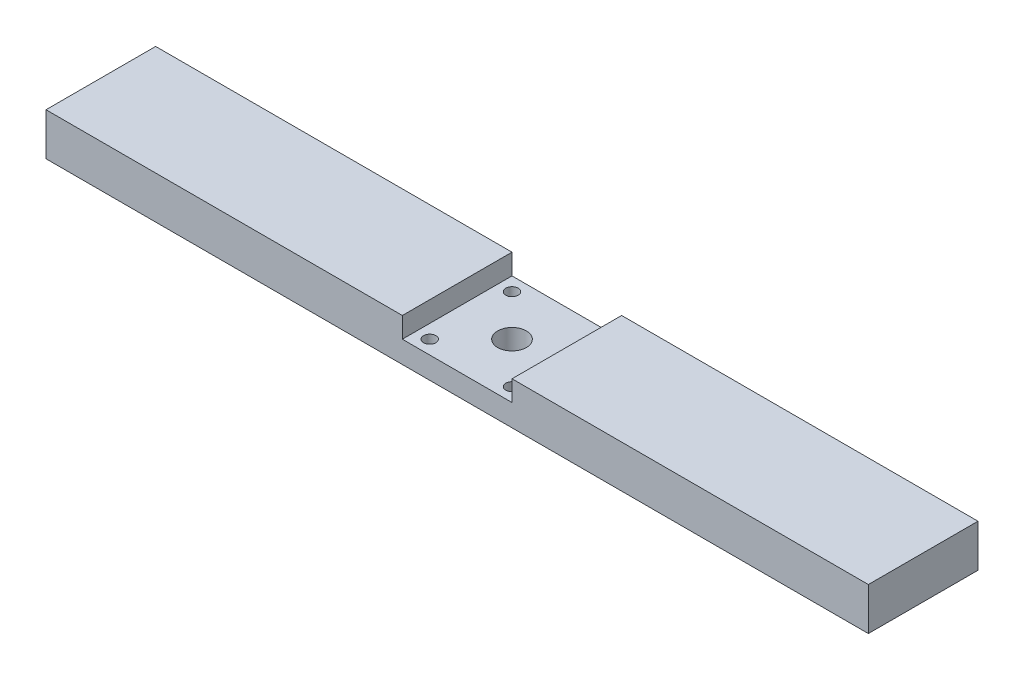
ISO-10303-21;
HEADER;
FILE_DESCRIPTION(('STEP AP214'),'2;1');
FILE_NAME('part.step','',(''),(''),'','','');
FILE_SCHEMA(('AUTOMOTIVE_DESIGN { 1 0 10303 214 1 1 1 1 }'));
ENDSEC;
DATA;
#1=APPLICATION_CONTEXT('core data for automotive mechanical design processes');
#2=APPLICATION_PROTOCOL_DEFINITION('international standard','automotive_design',2000,#1);
#3=PRODUCT_CONTEXT('',#1,'mechanical');
#4=PRODUCT('Part','Part','',(#3));
#5=PRODUCT_RELATED_PRODUCT_CATEGORY('part','',(#4));
#6=PRODUCT_DEFINITION_FORMATION('','',#4);
#7=PRODUCT_DEFINITION_CONTEXT('part definition',#1,'design');
#8=PRODUCT_DEFINITION('design','',#6,#7);
#9=PRODUCT_DEFINITION_SHAPE('','',#8);
#10=(LENGTH_UNIT() NAMED_UNIT(*) SI_UNIT(.MILLI.,.METRE.));
#11=(NAMED_UNIT(*) PLANE_ANGLE_UNIT() SI_UNIT($,.RADIAN.));
#12=(NAMED_UNIT(*) SI_UNIT($,.STERADIAN.) SOLID_ANGLE_UNIT());
#13=UNCERTAINTY_MEASURE_WITH_UNIT(LENGTH_MEASURE(1.E-05),#10,'distance_accuracy_value','');
#14=(GEOMETRIC_REPRESENTATION_CONTEXT(3) GLOBAL_UNCERTAINTY_ASSIGNED_CONTEXT((#13)) GLOBAL_UNIT_ASSIGNED_CONTEXT((#10,
#11,#12)) REPRESENTATION_CONTEXT('',''));
#15=CARTESIAN_POINT('',(0.,0.,0.));
#16=DIRECTION('',(0.,0.,1.));
#17=DIRECTION('',(1.,0.,0.));
#18=AXIS2_PLACEMENT_3D('',#15,#16,#17);
#19=CARTESIAN_POINT('',(-150.,7.75,20.));
#20=DIRECTION('',(0.,-1.,0.));
#21=DIRECTION('',(0.,0.,-1.));
#22=AXIS2_PLACEMENT_3D('',#19,#20,#21);
#23=PLANE('',#22);
#24=DIRECTION('',(-1.,0.,0.));
#25=VECTOR('',#24,1.);
#26=CARTESIAN_POINT('',(-150.,7.75,-20.));
#27=LINE('',#26,#25);
#28=CARTESIAN_POINT('',(-20.,7.75,-20.));
#29=VERTEX_POINT('',#28);
#30=CARTESIAN_POINT('',(-150.,7.75,-20.));
#31=VERTEX_POINT('',#30);
#32=EDGE_CURVE('E129',#29,#31,#27,.T.);
#33=ORIENTED_EDGE('',*,*,#32,.T.);
#34=DIRECTION('',(0.,0.,-1.));
#35=VECTOR('',#34,1.);
#36=CARTESIAN_POINT('',(-150.,7.75,20.));
#37=LINE('',#36,#35);
#38=CARTESIAN_POINT('',(-150.,7.75,20.));
#39=VERTEX_POINT('',#38);
#40=EDGE_CURVE('E11',#39,#31,#37,.T.);
#41=ORIENTED_EDGE('',*,*,#40,.F.);
#42=DIRECTION('',(-1.,0.,0.));
#43=VECTOR('',#42,1.);
#44=CARTESIAN_POINT('',(-150.,7.75,20.));
#45=LINE('',#44,#43);
#46=CARTESIAN_POINT('',(-20.,7.75,20.));
#47=VERTEX_POINT('',#46);
#48=EDGE_CURVE('E144',#47,#39,#45,.T.);
#49=ORIENTED_EDGE('',*,*,#48,.F.);
#50=DIRECTION('',(0.,0.,-1.));
#51=VECTOR('',#50,1.);
#52=CARTESIAN_POINT('',(-20.,7.75,20.));
#53=LINE('',#52,#51);
#54=EDGE_CURVE('E125',#47,#29,#53,.T.);
#55=ORIENTED_EDGE('',*,*,#54,.T.);
#56=EDGE_LOOP('',(#33,#41,#49,#55));
#57=FACE_BOUND('',#56,.T.);
#58=ADVANCED_FACE('F33',(#57),#23,.F.);
#59=CARTESIAN_POINT('',(-150.,7.75,20.));
#60=DIRECTION('',(1.,0.,0.));
#61=DIRECTION('',(0.,0.,-1.));
#62=AXIS2_PLACEMENT_3D('',#59,#60,#61);
#63=PLANE('',#62);
#64=DIRECTION('',(0.,-1.,0.));
#65=VECTOR('',#64,1.);
#66=CARTESIAN_POINT('',(-150.,7.75,-20.));
#67=LINE('',#66,#65);
#68=CARTESIAN_POINT('',(-150.,-7.75,-20.));
#69=VERTEX_POINT('',#68);
#70=EDGE_CURVE('E132',#31,#69,#67,.T.);
#71=ORIENTED_EDGE('',*,*,#70,.T.);
#72=DIRECTION('',(0.,0.,-1.));
#73=VECTOR('',#72,1.);
#74=CARTESIAN_POINT('',(-150.,-7.75,20.));
#75=LINE('',#74,#73);
#76=CARTESIAN_POINT('',(-150.,-7.75,20.));
#77=VERTEX_POINT('',#76);
#78=EDGE_CURVE('E41',#77,#69,#75,.T.);
#79=ORIENTED_EDGE('',*,*,#78,.F.);
#80=DIRECTION('',(0.,-1.,0.));
#81=VECTOR('',#80,1.);
#82=CARTESIAN_POINT('',(-150.,7.75,20.));
#83=LINE('',#82,#81);
#84=EDGE_CURVE('E92',#39,#77,#83,.T.);
#85=ORIENTED_EDGE('',*,*,#84,.F.);
#86=ORIENTED_EDGE('',*,*,#40,.T.);
#87=EDGE_LOOP('',(#71,#79,#85,#86));
#88=FACE_BOUND('',#87,.T.);
#89=ADVANCED_FACE('F227',(#88),#63,.F.);
#90=CARTESIAN_POINT('',(-150.,-7.75,20.));
#91=DIRECTION('',(0.,1.,0.));
#92=DIRECTION('',(-1.,0.,0.));
#93=AXIS2_PLACEMENT_3D('',#90,#91,#92);
#94=PLANE('',#93);
#95=CARTESIAN_POINT('',(-15.015,-7.75000000000001,-15.));
#96=DIRECTION('',(0.,1.,0.));
#97=DIRECTION('',(-1.,0.,0.));
#98=AXIS2_PLACEMENT_3D('',#95,#96,#97);
#99=CIRCLE('',#98,2.25);
#100=CARTESIAN_POINT('',(-17.265,-7.75000000000001,-15.));
#101=VERTEX_POINT('',#100);
#102=EDGE_CURVE('E133',#101,#101,#99,.T.);
#103=ORIENTED_EDGE('',*,*,#102,.T.);
#104=EDGE_LOOP('',(#103));
#105=FACE_BOUND('',#104,.T.);
#106=CARTESIAN_POINT('',(15.015,-7.75000000000002,15.));
#107=DIRECTION('',(0.,1.,0.));
#108=DIRECTION('',(-1.,0.,0.));
#109=AXIS2_PLACEMENT_3D('',#106,#107,#108);
#110=CIRCLE('',#109,2.25);
#111=CARTESIAN_POINT('',(12.765,-7.75000000000002,15.));
#112=VERTEX_POINT('',#111);
#113=EDGE_CURVE('E179',#112,#112,#110,.T.);
#114=ORIENTED_EDGE('',*,*,#113,.T.);
#115=EDGE_LOOP('',(#114));
#116=FACE_BOUND('',#115,.T.);
#117=CARTESIAN_POINT('',(-15.015,-7.75000000000001,15.));
#118=DIRECTION('',(0.,1.,0.));
#119=DIRECTION('',(-1.,0.,0.));
#120=AXIS2_PLACEMENT_3D('',#117,#118,#119);
#121=CIRCLE('',#120,2.25);
#122=CARTESIAN_POINT('',(-17.265,-7.75000000000001,15.));
#123=VERTEX_POINT('',#122);
#124=EDGE_CURVE('E182',#123,#123,#121,.T.);
#125=ORIENTED_EDGE('',*,*,#124,.T.);
#126=EDGE_LOOP('',(#125));
#127=FACE_BOUND('',#126,.T.);
#128=CARTESIAN_POINT('',(0.,-7.75000000000002,0.));
#129=DIRECTION('',(0.,1.,0.));
#130=DIRECTION('',(-1.,0.,0.));
#131=AXIS2_PLACEMENT_3D('',#128,#129,#130);
#132=CIRCLE('',#131,5.25);
#133=CARTESIAN_POINT('',(-5.25,-7.75000000000002,0.));
#134=VERTEX_POINT('',#133);
#135=EDGE_CURVE('E185',#134,#134,#132,.T.);
#136=ORIENTED_EDGE('',*,*,#135,.T.);
#137=EDGE_LOOP('',(#136));
#138=FACE_BOUND('',#137,.T.);
#139=CARTESIAN_POINT('',(15.015,-7.75000000000002,-15.));
#140=DIRECTION('',(0.,1.,0.));
#141=DIRECTION('',(-1.,0.,0.));
#142=AXIS2_PLACEMENT_3D('',#139,#140,#141);
#143=CIRCLE('',#142,2.25);
#144=CARTESIAN_POINT('',(12.765,-7.75000000000002,-15.));
#145=VERTEX_POINT('',#144);
#146=EDGE_CURVE('E188',#145,#145,#143,.T.);
#147=ORIENTED_EDGE('',*,*,#146,.T.);
#148=EDGE_LOOP('',(#147));
#149=FACE_BOUND('',#148,.T.);
#150=DIRECTION('',(1.,0.,0.));
#151=VECTOR('',#150,1.);
#152=CARTESIAN_POINT('',(-150.,-7.75,-20.));
#153=LINE('',#152,#151);
#154=CARTESIAN_POINT('',(150.,-7.75000000000004,-20.));
#155=VERTEX_POINT('',#154);
#156=EDGE_CURVE('E135',#69,#155,#153,.T.);
#157=ORIENTED_EDGE('',*,*,#156,.T.);
#158=DIRECTION('',(0.,0.,-1.));
#159=VECTOR('',#158,1.);
#160=CARTESIAN_POINT('',(150.,-7.75000000000004,20.));
#161=LINE('',#160,#159);
#162=CARTESIAN_POINT('',(150.,-7.75000000000004,20.));
#163=VERTEX_POINT('',#162);
#164=EDGE_CURVE('E151',#163,#155,#161,.T.);
#165=ORIENTED_EDGE('',*,*,#164,.F.);
#166=DIRECTION('',(1.,0.,0.));
#167=VECTOR('',#166,1.);
#168=CARTESIAN_POINT('',(-150.,-7.75,20.));
#169=LINE('',#168,#167);
#170=EDGE_CURVE('E159',#77,#163,#169,.T.);
#171=ORIENTED_EDGE('',*,*,#170,.F.);
#172=ORIENTED_EDGE('',*,*,#78,.T.);
#173=EDGE_LOOP('',(#157,#165,#171,#172));
#174=FACE_BOUND('',#173,.T.);
#175=ADVANCED_FACE('F157',(#105,#116,#127,#138,#149,#174),#94,.F.);
#176=CARTESIAN_POINT('',(150.,7.75000000000004,20.));
#177=DIRECTION('',(-1.,0.,0.));
#178=DIRECTION('',(0.,0.,1.));
#179=AXIS2_PLACEMENT_3D('',#176,#177,#178);
#180=PLANE('',#179);
#181=DIRECTION('',(0.,1.,0.));
#182=VECTOR('',#181,1.);
#183=CARTESIAN_POINT('',(150.,7.75000000000004,-20.));
#184=LINE('',#183,#182);
#185=CARTESIAN_POINT('',(150.,7.75000000000004,-20.));
#186=VERTEX_POINT('',#185);
#187=EDGE_CURVE('E137',#155,#186,#184,.T.);
#188=ORIENTED_EDGE('',*,*,#187,.T.);
#189=DIRECTION('',(0.,0.,-1.));
#190=VECTOR('',#189,1.);
#191=CARTESIAN_POINT('',(150.,7.75000000000004,20.));
#192=LINE('',#191,#190);
#193=CARTESIAN_POINT('',(150.,7.75000000000004,20.));
#194=VERTEX_POINT('',#193);
#195=EDGE_CURVE('E148',#194,#186,#192,.T.);
#196=ORIENTED_EDGE('',*,*,#195,.F.);
#197=DIRECTION('',(0.,1.,0.));
#198=VECTOR('',#197,1.);
#199=CARTESIAN_POINT('',(150.,7.75000000000004,20.));
#200=LINE('',#199,#198);
#201=EDGE_CURVE('E171',#163,#194,#200,.T.);
#202=ORIENTED_EDGE('',*,*,#201,.F.);
#203=ORIENTED_EDGE('',*,*,#164,.T.);
#204=EDGE_LOOP('',(#188,#196,#202,#203));
#205=FACE_BOUND('',#204,.T.);
#206=ADVANCED_FACE('F167',(#205),#180,.F.);
#207=CARTESIAN_POINT('',(150.,7.75000000000004,20.));
#208=DIRECTION('',(0.,-1.,0.));
#209=DIRECTION('',(1.,0.,0.));
#210=AXIS2_PLACEMENT_3D('',#207,#208,#209);
#211=PLANE('',#210);
#212=DIRECTION('',(-1.,0.,0.));
#213=VECTOR('',#212,1.);
#214=CARTESIAN_POINT('',(150.,7.75000000000004,-20.));
#215=LINE('',#214,#213);
#216=CARTESIAN_POINT('',(20.,7.75000000000001,-20.));
#217=VERTEX_POINT('',#216);
#218=EDGE_CURVE('E139',#186,#217,#215,.T.);
#219=ORIENTED_EDGE('',*,*,#218,.T.);
#220=DIRECTION('',(0.,0.,-1.));
#221=VECTOR('',#220,1.);
#222=CARTESIAN_POINT('',(20.,7.75000000000001,20.));
#223=LINE('',#222,#221);
#224=CARTESIAN_POINT('',(20.,7.75000000000001,20.));
#225=VERTEX_POINT('',#224);
#226=EDGE_CURVE('E120',#225,#217,#223,.T.);
#227=ORIENTED_EDGE('',*,*,#226,.F.);
#228=DIRECTION('',(-1.,0.,0.));
#229=VECTOR('',#228,1.);
#230=CARTESIAN_POINT('',(150.,7.75000000000004,20.));
#231=LINE('',#230,#229);
#232=EDGE_CURVE('E111',#194,#225,#231,.T.);
#233=ORIENTED_EDGE('',*,*,#232,.F.);
#234=ORIENTED_EDGE('',*,*,#195,.T.);
#235=EDGE_LOOP('',(#219,#227,#233,#234));
#236=FACE_BOUND('',#235,.T.);
#237=ADVANCED_FACE('F170',(#236),#211,.F.);
#238=CARTESIAN_POINT('',(20.,7.75000000000001,20.));
#239=DIRECTION('',(1.,0.,0.));
#240=DIRECTION('',(0.,1.,0.));
#241=AXIS2_PLACEMENT_3D('',#238,#239,#240);
#242=PLANE('',#241);
#243=DIRECTION('',(0.,-1.,0.));
#244=VECTOR('',#243,1.);
#245=CARTESIAN_POINT('',(20.,7.75000000000001,-20.));
#246=LINE('',#245,#244);
#247=CARTESIAN_POINT('',(20.,0.250000000000005,-20.));
#248=VERTEX_POINT('',#247);
#249=EDGE_CURVE('E119',#217,#248,#246,.T.);
#250=ORIENTED_EDGE('',*,*,#249,.T.);
#251=DIRECTION('',(0.,0.,-1.));
#252=VECTOR('',#251,1.);
#253=CARTESIAN_POINT('',(20.,0.250000000000005,20.));
#254=LINE('',#253,#252);
#255=CARTESIAN_POINT('',(20.,0.250000000000005,20.));
#256=VERTEX_POINT('',#255);
#257=EDGE_CURVE('E116',#256,#248,#254,.T.);
#258=ORIENTED_EDGE('',*,*,#257,.F.);
#259=DIRECTION('',(0.,-1.,0.));
#260=VECTOR('',#259,1.);
#261=CARTESIAN_POINT('',(20.,7.75000000000001,20.));
#262=LINE('',#261,#260);
#263=EDGE_CURVE('E105',#225,#256,#262,.T.);
#264=ORIENTED_EDGE('',*,*,#263,.F.);
#265=ORIENTED_EDGE('',*,*,#226,.T.);
#266=EDGE_LOOP('',(#250,#258,#264,#265));
#267=FACE_BOUND('',#266,.T.);
#268=ADVANCED_FACE('F117',(#267),#242,.F.);
#269=CARTESIAN_POINT('',(-20.,0.25,20.));
#270=DIRECTION('',(0.,-1.,0.));
#271=DIRECTION('',(1.,0.,0.));
#272=AXIS2_PLACEMENT_3D('',#269,#270,#271);
#273=PLANE('',#272);
#274=CARTESIAN_POINT('',(-15.015,0.250000000000003,-15.));
#275=DIRECTION('',(0.,1.,0.));
#276=DIRECTION('',(0.,0.,-1.));
#277=AXIS2_PLACEMENT_3D('',#274,#275,#276);
#278=CIRCLE('',#277,2.25);
#279=CARTESIAN_POINT('',(-15.015,0.250000000000003,-17.25));
#280=VERTEX_POINT('',#279);
#281=EDGE_CURVE('E194',#280,#280,#278,.T.);
#282=ORIENTED_EDGE('',*,*,#281,.F.);
#283=EDGE_LOOP('',(#282));
#284=FACE_BOUND('',#283,.T.);
#285=CARTESIAN_POINT('',(15.015,0.250000000000003,15.));
#286=DIRECTION('',(0.,1.,0.));
#287=DIRECTION('',(0.,0.,-1.));
#288=AXIS2_PLACEMENT_3D('',#285,#286,#287);
#289=CIRCLE('',#288,2.25);
#290=CARTESIAN_POINT('',(15.015,0.250000000000003,12.75));
#291=VERTEX_POINT('',#290);
#292=EDGE_CURVE('E195',#291,#291,#289,.T.);
#293=ORIENTED_EDGE('',*,*,#292,.F.);
#294=EDGE_LOOP('',(#293));
#295=FACE_BOUND('',#294,.T.);
#296=CARTESIAN_POINT('',(-15.015,0.250000000000003,15.));
#297=DIRECTION('',(0.,1.,0.));
#298=DIRECTION('',(0.,0.,1.));
#299=AXIS2_PLACEMENT_3D('',#296,#297,#298);
#300=CIRCLE('',#299,2.25);
#301=CARTESIAN_POINT('',(-15.015,0.250000000000003,17.25));
#302=VERTEX_POINT('',#301);
#303=EDGE_CURVE('E198',#302,#302,#300,.T.);
#304=ORIENTED_EDGE('',*,*,#303,.F.);
#305=EDGE_LOOP('',(#304));
#306=FACE_BOUND('',#305,.T.);
#307=CARTESIAN_POINT('',(0.,0.250000000000003,0.));
#308=DIRECTION('',(0.,1.,0.));
#309=DIRECTION('',(0.,0.,1.));
#310=AXIS2_PLACEMENT_3D('',#307,#308,#309);
#311=CIRCLE('',#310,5.25);
#312=CARTESIAN_POINT('',(0.,0.250000000000003,5.25));
#313=VERTEX_POINT('',#312);
#314=EDGE_CURVE('E201',#313,#313,#311,.T.);
#315=ORIENTED_EDGE('',*,*,#314,.F.);
#316=EDGE_LOOP('',(#315));
#317=FACE_BOUND('',#316,.T.);
#318=CARTESIAN_POINT('',(15.015,0.250000000000003,-15.));
#319=DIRECTION('',(0.,1.,0.));
#320=DIRECTION('',(0.,0.,1.));
#321=AXIS2_PLACEMENT_3D('',#318,#319,#320);
#322=CIRCLE('',#321,2.25);
#323=CARTESIAN_POINT('',(15.015,0.250000000000003,-12.75));
#324=VERTEX_POINT('',#323);
#325=EDGE_CURVE('E191',#324,#324,#322,.T.);
#326=ORIENTED_EDGE('',*,*,#325,.F.);
#327=EDGE_LOOP('',(#326));
#328=FACE_BOUND('',#327,.T.);
#329=DIRECTION('',(-1.,0.,0.));
#330=VECTOR('',#329,1.);
#331=CARTESIAN_POINT('',(-20.,0.25,-20.));
#332=LINE('',#331,#330);
#333=CARTESIAN_POINT('',(-20.,0.25,-20.));
#334=VERTEX_POINT('',#333);
#335=EDGE_CURVE('E78',#248,#334,#332,.T.);
#336=ORIENTED_EDGE('',*,*,#335,.T.);
#337=DIRECTION('',(0.,0.,-1.));
#338=VECTOR('',#337,1.);
#339=CARTESIAN_POINT('',(-20.,0.25,20.));
#340=LINE('',#339,#338);
#341=CARTESIAN_POINT('',(-20.,0.25,20.));
#342=VERTEX_POINT('',#341);
#343=EDGE_CURVE('E121',#342,#334,#340,.T.);
#344=ORIENTED_EDGE('',*,*,#343,.F.);
#345=DIRECTION('',(-1.,0.,0.));
#346=VECTOR('',#345,1.);
#347=CARTESIAN_POINT('',(-20.,0.25,20.));
#348=LINE('',#347,#346);
#349=EDGE_CURVE('E109',#256,#342,#348,.T.);
#350=ORIENTED_EDGE('',*,*,#349,.F.);
#351=ORIENTED_EDGE('',*,*,#257,.T.);
#352=EDGE_LOOP('',(#336,#344,#350,#351));
#353=FACE_BOUND('',#352,.T.);
#354=ADVANCED_FACE('F123',(#284,#295,#306,#317,#328,#353),#273,.F.);
#355=CARTESIAN_POINT('',(-20.,7.75,20.));
#356=DIRECTION('',(-1.,0.,0.));
#357=DIRECTION('',(0.,-1.,0.));
#358=AXIS2_PLACEMENT_3D('',#355,#356,#357);
#359=PLANE('',#358);
#360=DIRECTION('',(0.,1.,0.));
#361=VECTOR('',#360,1.);
#362=CARTESIAN_POINT('',(-20.,7.75,-20.));
#363=LINE('',#362,#361);
#364=EDGE_CURVE('E84',#334,#29,#363,.T.);
#365=ORIENTED_EDGE('',*,*,#364,.T.);
#366=ORIENTED_EDGE('',*,*,#54,.F.);
#367=DIRECTION('',(0.,1.,0.));
#368=VECTOR('',#367,1.);
#369=CARTESIAN_POINT('',(-20.,7.75,20.));
#370=LINE('',#369,#368);
#371=EDGE_CURVE('E49',#342,#47,#370,.T.);
#372=ORIENTED_EDGE('',*,*,#371,.F.);
#373=ORIENTED_EDGE('',*,*,#343,.T.);
#374=EDGE_LOOP('',(#365,#366,#372,#373));
#375=FACE_BOUND('',#374,.T.);
#376=ADVANCED_FACE('F212',(#375),#359,.F.);
#377=CARTESIAN_POINT('',(0.,0.,20.));
#378=DIRECTION('',(0.,0.,-1.));
#379=DIRECTION('',(-1.,0.,0.));
#380=AXIS2_PLACEMENT_3D('',#377,#378,#379);
#381=PLANE('',#380);
#382=ORIENTED_EDGE('',*,*,#48,.T.);
#383=ORIENTED_EDGE('',*,*,#84,.T.);
#384=ORIENTED_EDGE('',*,*,#170,.T.);
#385=ORIENTED_EDGE('',*,*,#201,.T.);
#386=ORIENTED_EDGE('',*,*,#232,.T.);
#387=ORIENTED_EDGE('',*,*,#263,.T.);
#388=ORIENTED_EDGE('',*,*,#349,.T.);
#389=ORIENTED_EDGE('',*,*,#371,.T.);
#390=EDGE_LOOP('',(#382,#383,#384,#385,#386,#387,#388,#389));
#391=FACE_BOUND('',#390,.T.);
#392=ADVANCED_FACE('F107',(#391),#381,.F.);
#393=CARTESIAN_POINT('',(0.,0.,-20.));
#394=DIRECTION('',(0.,0.,-1.));
#395=DIRECTION('',(-1.,0.,0.));
#396=AXIS2_PLACEMENT_3D('',#393,#394,#395);
#397=PLANE('',#396);
#398=ORIENTED_EDGE('',*,*,#32,.F.);
#399=ORIENTED_EDGE('',*,*,#364,.F.);
#400=ORIENTED_EDGE('',*,*,#335,.F.);
#401=ORIENTED_EDGE('',*,*,#249,.F.);
#402=ORIENTED_EDGE('',*,*,#218,.F.);
#403=ORIENTED_EDGE('',*,*,#187,.F.);
#404=ORIENTED_EDGE('',*,*,#156,.F.);
#405=ORIENTED_EDGE('',*,*,#70,.F.);
#406=EDGE_LOOP('',(#398,#399,#400,#401,#402,#403,#404,#405));
#407=FACE_BOUND('',#406,.T.);
#408=ADVANCED_FACE('F163',(#407),#397,.T.);
#409=CARTESIAN_POINT('',(15.015,-39.75,-15.));
#410=DIRECTION('',(0.,1.,0.));
#411=DIRECTION('',(0.,0.,1.));
#412=AXIS2_PLACEMENT_3D('',#409,#410,#411);
#413=CYLINDRICAL_SURFACE('',#412,2.25);
#414=ORIENTED_EDGE('',*,*,#325,.T.);
#415=EDGE_LOOP('',(#414));
#416=FACE_BOUND('',#415,.T.);
#417=ORIENTED_EDGE('',*,*,#146,.F.);
#418=EDGE_LOOP('',(#417));
#419=FACE_BOUND('',#418,.T.);
#420=ADVANCED_FACE('F219',(#416,#419),#413,.F.);
#421=CARTESIAN_POINT('',(0.,-39.75,0.));
#422=DIRECTION('',(0.,1.,0.));
#423=DIRECTION('',(0.,0.,1.));
#424=AXIS2_PLACEMENT_3D('',#421,#422,#423);
#425=CYLINDRICAL_SURFACE('',#424,5.25);
#426=ORIENTED_EDGE('',*,*,#314,.T.);
#427=EDGE_LOOP('',(#426));
#428=FACE_BOUND('',#427,.T.);
#429=ORIENTED_EDGE('',*,*,#135,.F.);
#430=EDGE_LOOP('',(#429));
#431=FACE_BOUND('',#430,.T.);
#432=ADVANCED_FACE('F222',(#428,#431),#425,.F.);
#433=CARTESIAN_POINT('',(-15.015,-39.75,15.));
#434=DIRECTION('',(0.,1.,0.));
#435=DIRECTION('',(0.,0.,1.));
#436=AXIS2_PLACEMENT_3D('',#433,#434,#435);
#437=CYLINDRICAL_SURFACE('',#436,2.25);
#438=ORIENTED_EDGE('',*,*,#303,.T.);
#439=EDGE_LOOP('',(#438));
#440=FACE_BOUND('',#439,.T.);
#441=ORIENTED_EDGE('',*,*,#124,.F.);
#442=EDGE_LOOP('',(#441));
#443=FACE_BOUND('',#442,.T.);
#444=ADVANCED_FACE('F207',(#440,#443),#437,.F.);
#445=CARTESIAN_POINT('',(15.015,-39.75,15.));
#446=DIRECTION('',(0.,1.,0.));
#447=DIRECTION('',(0.,0.,1.));
#448=AXIS2_PLACEMENT_3D('',#445,#446,#447);
#449=CYLINDRICAL_SURFACE('',#448,2.25);
#450=ORIENTED_EDGE('',*,*,#292,.T.);
#451=EDGE_LOOP('',(#450));
#452=FACE_BOUND('',#451,.T.);
#453=ORIENTED_EDGE('',*,*,#113,.F.);
#454=EDGE_LOOP('',(#453));
#455=FACE_BOUND('',#454,.T.);
#456=ADVANCED_FACE('F295',(#452,#455),#449,.F.);
#457=CARTESIAN_POINT('',(-15.015,-39.75,-15.));
#458=DIRECTION('',(0.,1.,0.));
#459=DIRECTION('',(0.,0.,1.));
#460=AXIS2_PLACEMENT_3D('',#457,#458,#459);
#461=CYLINDRICAL_SURFACE('',#460,2.25);
#462=ORIENTED_EDGE('',*,*,#281,.T.);
#463=EDGE_LOOP('',(#462));
#464=FACE_BOUND('',#463,.T.);
#465=ORIENTED_EDGE('',*,*,#102,.F.);
#466=EDGE_LOOP('',(#465));
#467=FACE_BOUND('',#466,.T.);
#468=ADVANCED_FACE('F304',(#464,#467),#461,.F.);
#469=CLOSED_SHELL('',(#58,#89,#175,#206,#237,#268,#354,#376,#392,#408,#420,#432,#444,#456,#468));
#470=MANIFOLD_SOLID_BREP('B2',#469);
#471=ADVANCED_BREP_SHAPE_REPRESENTATION('',(#18,#470),#14);
#472=SHAPE_DEFINITION_REPRESENTATION(#9,#471);
ENDSEC;
END-ISO-10303-21;
